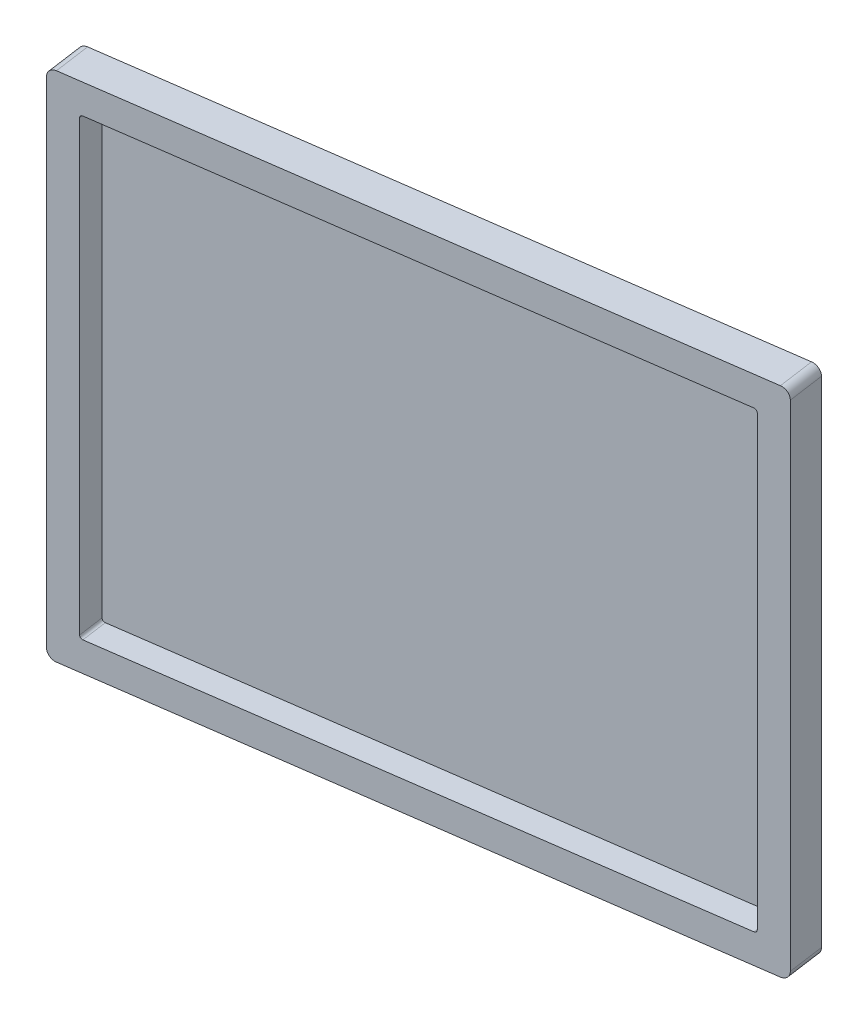
ISO-10303-21;
HEADER;
FILE_DESCRIPTION(('STEP AP214'),'2;1');
FILE_NAME('part.step','',(''),(''),'','','');
FILE_SCHEMA(('AUTOMOTIVE_DESIGN { 1 0 10303 214 1 1 1 1 }'));
ENDSEC;
DATA;
#1=APPLICATION_CONTEXT('core data for automotive mechanical design processes');
#2=APPLICATION_PROTOCOL_DEFINITION('international standard','automotive_design',2000,#1);
#3=PRODUCT_CONTEXT('',#1,'mechanical');
#4=PRODUCT('Part','Part','',(#3));
#5=PRODUCT_RELATED_PRODUCT_CATEGORY('part','',(#4));
#6=PRODUCT_DEFINITION_FORMATION('','',#4);
#7=PRODUCT_DEFINITION_CONTEXT('part definition',#1,'design');
#8=PRODUCT_DEFINITION('design','',#6,#7);
#9=PRODUCT_DEFINITION_SHAPE('','',#8);
#10=(LENGTH_UNIT() NAMED_UNIT(*) SI_UNIT(.MILLI.,.METRE.));
#11=(NAMED_UNIT(*) PLANE_ANGLE_UNIT() SI_UNIT($,.RADIAN.));
#12=(NAMED_UNIT(*) SI_UNIT($,.STERADIAN.) SOLID_ANGLE_UNIT());
#13=UNCERTAINTY_MEASURE_WITH_UNIT(LENGTH_MEASURE(1.E-05),#10,'distance_accuracy_value','');
#14=(GEOMETRIC_REPRESENTATION_CONTEXT(3) GLOBAL_UNCERTAINTY_ASSIGNED_CONTEXT((#13)) GLOBAL_UNIT_ASSIGNED_CONTEXT((#10,
#11,#12)) REPRESENTATION_CONTEXT('',''));
#15=CARTESIAN_POINT('',(0.,0.,0.));
#16=DIRECTION('',(0.,0.,1.));
#17=DIRECTION('',(1.,0.,0.));
#18=AXIS2_PLACEMENT_3D('',#15,#16,#17);
#19=CARTESIAN_POINT('',(387.664057965126,153.,664.601135131367));
#20=DIRECTION('',(0.99026806874157,0.,-0.139173100960065));
#21=DIRECTION('',(-0.139173100960065,0.,-0.99026806874157));
#22=AXIS2_PLACEMENT_3D('',#19,#20,#21);
#23=PLANE('',#22);
#24=DIRECTION('',(-0.139173100960065,0.,-0.99026806874157));
#25=VECTOR('',#24,1.);
#26=CARTESIAN_POINT('',(387.664057965126,153.,664.601135131367));
#27=LINE('',#26,#25);
#28=CARTESIAN_POINT('',(384.741422844965,153.,643.805505687794));
#29=VERTEX_POINT('',#28);
#30=CARTESIAN_POINT('',(384.184730441125,153.,639.844433412828));
#31=VERTEX_POINT('',#30);
#32=EDGE_CURVE('E348',#29,#31,#27,.T.);
#33=ORIENTED_EDGE('',*,*,#32,.F.);
#34=DIRECTION('',(0.,-1.,0.));
#35=VECTOR('',#34,1.);
#36=CARTESIAN_POINT('',(384.741422844965,155.,643.805505687794));
#37=LINE('',#36,#35);
#38=CARTESIAN_POINT('',(384.741422844965,-153.,643.805505687794));
#39=VERTEX_POINT('',#38);
#40=EDGE_CURVE('E461',#29,#39,#37,.T.);
#41=ORIENTED_EDGE('',*,*,#40,.T.);
#42=DIRECTION('',(-0.139173100960065,0.,-0.99026806874157));
#43=VECTOR('',#42,1.);
#44=CARTESIAN_POINT('',(387.664057965126,-153.,664.601135131367));
#45=LINE('',#44,#43);
#46=CARTESIAN_POINT('',(384.184730441125,-153.,639.844433412828));
#47=VERTEX_POINT('',#46);
#48=EDGE_CURVE('E347',#39,#47,#45,.T.);
#49=ORIENTED_EDGE('',*,*,#48,.T.);
#50=DIRECTION('',(0.,-1.,0.));
#51=VECTOR('',#50,1.);
#52=CARTESIAN_POINT('',(384.184730441125,153.,639.844433412828));
#53=LINE('',#52,#51);
#54=EDGE_CURVE('E317',#31,#47,#53,.T.);
#55=ORIENTED_EDGE('',*,*,#54,.F.);
#56=EDGE_LOOP('',(#33,#41,#49,#55));
#57=FACE_BOUND('',#56,.T.);
#58=ADVANCED_FACE('F43',(#57),#23,.T.);
#59=CARTESIAN_POINT('',(793.67396614917,-153.,607.540163737741));
#60=DIRECTION('',(-0.99026806874157,0.,0.139173100960065));
#61=DIRECTION('',(0.139173100960065,0.,0.99026806874157));
#62=AXIS2_PLACEMENT_3D('',#59,#60,#61);
#63=PLANE('',#62);
#64=DIRECTION('',(-0.139173100960065,0.,-0.99026806874157));
#65=VECTOR('',#64,1.);
#66=CARTESIAN_POINT('',(793.67396614917,-153.,607.540163737741));
#67=LINE('',#66,#65);
#68=CARTESIAN_POINT('',(790.751331029009,-153.,586.744534294167));
#69=VERTEX_POINT('',#68);
#70=CARTESIAN_POINT('',(790.194638625169,-153.,582.783462019201));
#71=VERTEX_POINT('',#70);
#72=EDGE_CURVE('E333',#69,#71,#67,.T.);
#73=ORIENTED_EDGE('',*,*,#72,.F.);
#74=DIRECTION('',(0.,1.,0.));
#75=VECTOR('',#74,1.);
#76=CARTESIAN_POINT('',(790.751331029009,-155.,586.744534294167));
#77=LINE('',#76,#75);
#78=CARTESIAN_POINT('',(790.751331029009,153.,586.744534294167));
#79=VERTEX_POINT('',#78);
#80=EDGE_CURVE('E456',#69,#79,#77,.T.);
#81=ORIENTED_EDGE('',*,*,#80,.T.);
#82=DIRECTION('',(-0.139173100960065,0.,-0.99026806874157));
#83=VECTOR('',#82,1.);
#84=CARTESIAN_POINT('',(793.67396614917,153.,607.540163737741));
#85=LINE('',#84,#83);
#86=CARTESIAN_POINT('',(790.194638625169,153.,582.783462019201));
#87=VERTEX_POINT('',#86);
#88=EDGE_CURVE('E309',#79,#87,#85,.T.);
#89=ORIENTED_EDGE('',*,*,#88,.T.);
#90=DIRECTION('',(0.,1.,0.));
#91=VECTOR('',#90,1.);
#92=CARTESIAN_POINT('',(790.194638625169,-153.,582.783462019201));
#93=LINE('',#92,#91);
#94=EDGE_CURVE('E293',#71,#87,#93,.T.);
#95=ORIENTED_EDGE('',*,*,#94,.F.);
#96=EDGE_LOOP('',(#73,#81,#89,#95));
#97=FACE_BOUND('',#96,.T.);
#98=ADVANCED_FACE('F482',(#97),#63,.T.);
#99=CARTESIAN_POINT('',(791.693430011687,153.,607.818509939661));
#100=DIRECTION('',(-0.139173100960065,0.,-0.99026806874157));
#101=DIRECTION('',(-0.99026806874157,0.,0.139173100960065));
#102=AXIS2_PLACEMENT_3D('',#99,#100,#101);
#103=CYLINDRICAL_SURFACE('',#102,1.99999999999999);
#104=ORIENTED_EDGE('',*,*,#88,.F.);
#105=CARTESIAN_POINT('',(788.770794891526,153.,587.022880496088));
#106=DIRECTION('',(0.139173100960065,0.,0.99026806874157));
#107=DIRECTION('',(0.99026806874157,0.,-0.139173100960065));
#108=AXIS2_PLACEMENT_3D('',#105,#106,#107);
#109=CIRCLE('',#108,1.99999999999999);
#110=CARTESIAN_POINT('',(788.770794891526,155.,587.022880496088));
#111=VERTEX_POINT('',#110);
#112=EDGE_CURVE('E287',#79,#111,#109,.T.);
#113=ORIENTED_EDGE('',*,*,#112,.T.);
#114=DIRECTION('',(-0.139173100960065,0.,-0.99026806874157));
#115=VECTOR('',#114,1.);
#116=CARTESIAN_POINT('',(791.693430011687,155.,607.818509939661));
#117=LINE('',#116,#115);
#118=CARTESIAN_POINT('',(788.214102487686,155.,583.061808221121));
#119=VERTEX_POINT('',#118);
#120=EDGE_CURVE('E360',#111,#119,#117,.T.);
#121=ORIENTED_EDGE('',*,*,#120,.T.);
#122=CARTESIAN_POINT('',(788.214102487686,153.,583.061808221121));
#123=DIRECTION('',(0.139173100960065,0.,0.99026806874157));
#124=DIRECTION('',(0.99026806874157,0.,-0.139173100960065));
#125=AXIS2_PLACEMENT_3D('',#122,#123,#124);
#126=CIRCLE('',#125,1.99999999999999);
#127=EDGE_CURVE('E292',#87,#119,#126,.T.);
#128=ORIENTED_EDGE('',*,*,#127,.F.);
#129=EDGE_LOOP('',(#104,#113,#121,#128));
#130=FACE_BOUND('',#129,.T.);
#131=ADVANCED_FACE('F487',(#130),#103,.F.);
#132=CARTESIAN_POINT('',(791.693430011687,155.,607.818509939661));
#133=DIRECTION('',(0.,-1.,0.));
#134=DIRECTION('',(-0.139173100960065,0.,-0.99026806874157));
#135=AXIS2_PLACEMENT_3D('',#132,#133,#134);
#136=PLANE('',#135);
#137=ORIENTED_EDGE('',*,*,#120,.F.);
#138=DIRECTION('',(-0.99026806874157,0.,0.139173100960065));
#139=VECTOR('',#138,1.);
#140=CARTESIAN_POINT('',(790.751331029009,155.,586.744534294167));
#141=LINE('',#140,#139);
#142=CARTESIAN_POINT('',(386.721958982448,155.,643.527159485874));
#143=VERTEX_POINT('',#142);
#144=EDGE_CURVE('E453',#111,#143,#141,.T.);
#145=ORIENTED_EDGE('',*,*,#144,.T.);
#146=DIRECTION('',(-0.139173100960065,0.,-0.99026806874157));
#147=VECTOR('',#146,1.);
#148=CARTESIAN_POINT('',(389.64459410261,155.,664.322788929447));
#149=LINE('',#148,#147);
#150=CARTESIAN_POINT('',(386.165266578608,155.,639.566087210908));
#151=VERTEX_POINT('',#150);
#152=EDGE_CURVE('E354',#143,#151,#149,.T.);
#153=ORIENTED_EDGE('',*,*,#152,.T.);
#154=DIRECTION('',(-0.99026806874157,0.,0.139173100960065));
#155=VECTOR('',#154,1.);
#156=CARTESIAN_POINT('',(788.214102487686,155.,583.061808221121));
#157=LINE('',#156,#155);
#158=EDGE_CURVE('E311',#119,#151,#157,.T.);
#159=ORIENTED_EDGE('',*,*,#158,.F.);
#160=EDGE_LOOP('',(#137,#145,#153,#159));
#161=FACE_BOUND('',#160,.T.);
#162=ADVANCED_FACE('F506',(#161),#136,.T.);
#163=CARTESIAN_POINT('',(389.64459410261,153.,664.322788929447));
#164=DIRECTION('',(-0.139173100960065,0.,-0.99026806874157));
#165=DIRECTION('',(-0.99026806874157,0.,0.139173100960065));
#166=AXIS2_PLACEMENT_3D('',#163,#164,#165);
#167=CYLINDRICAL_SURFACE('',#166,1.99999999999999);
#168=ORIENTED_EDGE('',*,*,#152,.F.);
#169=CARTESIAN_POINT('',(386.721958982448,153.,643.527159485874));
#170=DIRECTION('',(0.139173100960065,0.,0.99026806874157));
#171=DIRECTION('',(0.99026806874157,0.,-0.139173100960065));
#172=AXIS2_PLACEMENT_3D('',#169,#170,#171);
#173=CIRCLE('',#172,1.99999999999999);
#174=EDGE_CURVE('E282',#143,#29,#173,.T.);
#175=ORIENTED_EDGE('',*,*,#174,.T.);
#176=ORIENTED_EDGE('',*,*,#32,.T.);
#177=CARTESIAN_POINT('',(386.165266578608,153.,639.566087210908));
#178=DIRECTION('',(0.139173100960065,0.,0.99026806874157));
#179=DIRECTION('',(0.99026806874157,0.,-0.139173100960065));
#180=AXIS2_PLACEMENT_3D('',#177,#178,#179);
#181=CIRCLE('',#180,1.99999999999999);
#182=EDGE_CURVE('E316',#151,#31,#181,.T.);
#183=ORIENTED_EDGE('',*,*,#182,.F.);
#184=EDGE_LOOP('',(#168,#175,#176,#183));
#185=FACE_BOUND('',#184,.T.);
#186=ADVANCED_FACE('F505',(#185),#167,.F.);
#187=CARTESIAN_POINT('',(389.64459410261,-153.,664.322788929447));
#188=DIRECTION('',(-0.139173100960065,0.,-0.99026806874157));
#189=DIRECTION('',(-0.99026806874157,0.,0.139173100960065));
#190=AXIS2_PLACEMENT_3D('',#187,#188,#189);
#191=CYLINDRICAL_SURFACE('',#190,1.99999999999999);
#192=ORIENTED_EDGE('',*,*,#48,.F.);
#193=CARTESIAN_POINT('',(386.721958982448,-153.,643.527159485874));
#194=DIRECTION('',(0.139173100960065,0.,0.99026806874157));
#195=DIRECTION('',(0.99026806874157,0.,-0.139173100960065));
#196=AXIS2_PLACEMENT_3D('',#193,#194,#195);
#197=CIRCLE('',#196,1.99999999999999);
#198=CARTESIAN_POINT('',(386.721958982448,-155.,643.527159485874));
#199=VERTEX_POINT('',#198);
#200=EDGE_CURVE('E285',#39,#199,#197,.T.);
#201=ORIENTED_EDGE('',*,*,#200,.T.);
#202=DIRECTION('',(-0.139173100960065,0.,-0.99026806874157));
#203=VECTOR('',#202,1.);
#204=CARTESIAN_POINT('',(389.64459410261,-155.,664.322788929447));
#205=LINE('',#204,#203);
#206=CARTESIAN_POINT('',(386.165266578608,-155.,639.566087210908));
#207=VERTEX_POINT('',#206);
#208=EDGE_CURVE('E345',#199,#207,#205,.T.);
#209=ORIENTED_EDGE('',*,*,#208,.T.);
#210=CARTESIAN_POINT('',(386.165266578608,-153.,639.566087210908));
#211=DIRECTION('',(0.139173100960065,0.,0.99026806874157));
#212=DIRECTION('',(0.99026806874157,0.,-0.139173100960065));
#213=AXIS2_PLACEMENT_3D('',#210,#211,#212);
#214=CIRCLE('',#213,1.99999999999999);
#215=EDGE_CURVE('E325',#47,#207,#214,.T.);
#216=ORIENTED_EDGE('',*,*,#215,.F.);
#217=EDGE_LOOP('',(#192,#201,#209,#216));
#218=FACE_BOUND('',#217,.T.);
#219=ADVANCED_FACE('F503',(#218),#191,.F.);
#220=CARTESIAN_POINT('',(389.64459410261,-155.,664.322788929447));
#221=DIRECTION('',(0.,1.,0.));
#222=DIRECTION('',(0.139173100960065,0.,0.99026806874157));
#223=AXIS2_PLACEMENT_3D('',#220,#221,#222);
#224=PLANE('',#223);
#225=ORIENTED_EDGE('',*,*,#208,.F.);
#226=DIRECTION('',(0.99026806874157,0.,-0.139173100960065));
#227=VECTOR('',#226,1.);
#228=CARTESIAN_POINT('',(384.741422844965,-155.,643.805505687794));
#229=LINE('',#228,#227);
#230=CARTESIAN_POINT('',(788.770794891526,-155.,587.022880496088));
#231=VERTEX_POINT('',#230);
#232=EDGE_CURVE('E466',#199,#231,#229,.T.);
#233=ORIENTED_EDGE('',*,*,#232,.T.);
#234=DIRECTION('',(-0.139173100960065,0.,-0.99026806874157));
#235=VECTOR('',#234,1.);
#236=CARTESIAN_POINT('',(791.693430011687,-155.,607.818509939661));
#237=LINE('',#236,#235);
#238=CARTESIAN_POINT('',(788.214102487686,-155.,583.061808221121));
#239=VERTEX_POINT('',#238);
#240=EDGE_CURVE('E336',#231,#239,#237,.T.);
#241=ORIENTED_EDGE('',*,*,#240,.T.);
#242=DIRECTION('',(0.99026806874157,0.,-0.139173100960065));
#243=VECTOR('',#242,1.);
#244=CARTESIAN_POINT('',(386.165266578608,-155.,639.566087210908));
#245=LINE('',#244,#243);
#246=EDGE_CURVE('E324',#207,#239,#245,.T.);
#247=ORIENTED_EDGE('',*,*,#246,.F.);
#248=EDGE_LOOP('',(#225,#233,#241,#247));
#249=FACE_BOUND('',#248,.T.);
#250=ADVANCED_FACE('F515',(#249),#224,.T.);
#251=CARTESIAN_POINT('',(791.693430011687,-153.,607.818509939661));
#252=DIRECTION('',(-0.139173100960065,0.,-0.99026806874157));
#253=DIRECTION('',(-0.99026806874157,0.,0.139173100960065));
#254=AXIS2_PLACEMENT_3D('',#251,#252,#253);
#255=CYLINDRICAL_SURFACE('',#254,1.99999999999999);
#256=ORIENTED_EDGE('',*,*,#240,.F.);
#257=CARTESIAN_POINT('',(788.770794891526,-153.,587.022880496088));
#258=DIRECTION('',(0.139173100960065,0.,0.99026806874157));
#259=DIRECTION('',(0.99026806874157,0.,-0.139173100960065));
#260=AXIS2_PLACEMENT_3D('',#257,#258,#259);
#261=CIRCLE('',#260,1.99999999999999);
#262=EDGE_CURVE('E11',#231,#69,#261,.T.);
#263=ORIENTED_EDGE('',*,*,#262,.T.);
#264=ORIENTED_EDGE('',*,*,#72,.T.);
#265=CARTESIAN_POINT('',(788.214102487686,-153.,583.061808221121));
#266=DIRECTION('',(0.139173100960065,0.,0.99026806874157));
#267=DIRECTION('',(0.99026806874157,0.,-0.139173100960065));
#268=AXIS2_PLACEMENT_3D('',#265,#266,#267);
#269=CIRCLE('',#268,1.99999999999999);
#270=EDGE_CURVE('E327',#239,#71,#269,.T.);
#271=ORIENTED_EDGE('',*,*,#270,.F.);
#272=EDGE_LOOP('',(#256,#263,#264,#271));
#273=FACE_BOUND('',#272,.T.);
#274=ADVANCED_FACE('F528',(#273),#255,.F.);
#275=CARTESIAN_POINT('',(807.537719111552,169.,605.5917403243));
#276=DIRECTION('',(0.139173100960065,0.,0.99026806874157));
#277=DIRECTION('',(0.99026806874157,0.,-0.139173100960065));
#278=AXIS2_PLACEMENT_3D('',#275,#276,#277);
#279=PLANE('',#278);
#280=CARTESIAN_POINT('',(807.537719111552,169.,605.5917403243));
#281=DIRECTION('',(0.139173100960065,0.,0.99026806874157));
#282=DIRECTION('',(0.99026806874157,0.,-0.139173100960065));
#283=AXIS2_PLACEMENT_3D('',#280,#281,#282);
#284=CIRCLE('',#283,6.00000000000003);
#285=CARTESIAN_POINT('',(813.479327524002,169.,604.756701718539));
#286=VERTEX_POINT('',#285);
#287=CARTESIAN_POINT('',(807.537719111552,175.,605.5917403243));
#288=VERTEX_POINT('',#287);
#289=EDGE_CURVE('E363',#286,#288,#284,.T.);
#290=ORIENTED_EDGE('',*,*,#289,.T.);
#291=DIRECTION('',(-0.99026806874157,0.,0.139173100960065));
#292=VECTOR('',#291,1.);
#293=CARTESIAN_POINT('',(807.537719111552,175.,605.5917403243));
#294=LINE('',#293,#292);
#295=CARTESIAN_POINT('',(373.800305002744,175.,666.549558544808));
#296=VERTEX_POINT('',#295);
#297=EDGE_CURVE('E365',#288,#296,#294,.T.);
#298=ORIENTED_EDGE('',*,*,#297,.T.);
#299=CARTESIAN_POINT('',(373.800305002744,169.,666.549558544808));
#300=DIRECTION('',(0.139173100960065,0.,0.99026806874157));
#301=DIRECTION('',(0.99026806874157,0.,-0.139173100960065));
#302=AXIS2_PLACEMENT_3D('',#299,#300,#301);
#303=CIRCLE('',#302,6.00000000000003);
#304=CARTESIAN_POINT('',(367.858696590295,169.,667.384597150569));
#305=VERTEX_POINT('',#304);
#306=EDGE_CURVE('E370',#296,#305,#303,.T.);
#307=ORIENTED_EDGE('',*,*,#306,.T.);
#308=DIRECTION('',(0.,-1.,0.));
#309=VECTOR('',#308,1.);
#310=CARTESIAN_POINT('',(367.858696590295,169.,667.384597150569));
#311=LINE('',#310,#309);
#312=CARTESIAN_POINT('',(367.858696590295,-169.,667.384597150569));
#313=VERTEX_POINT('',#312);
#314=EDGE_CURVE('E369',#305,#313,#311,.T.);
#315=ORIENTED_EDGE('',*,*,#314,.T.);
#316=CARTESIAN_POINT('',(373.800305002744,-169.,666.549558544808));
#317=DIRECTION('',(0.139173100960065,0.,0.99026806874157));
#318=DIRECTION('',(0.99026806874157,0.,-0.139173100960065));
#319=AXIS2_PLACEMENT_3D('',#316,#317,#318);
#320=CIRCLE('',#319,6.00000000000003);
#321=CARTESIAN_POINT('',(373.800305002744,-175.,666.549558544808));
#322=VERTEX_POINT('',#321);
#323=EDGE_CURVE('E371',#313,#322,#320,.T.);
#324=ORIENTED_EDGE('',*,*,#323,.T.);
#325=DIRECTION('',(0.99026806874157,0.,-0.139173100960065));
#326=VECTOR('',#325,1.);
#327=CARTESIAN_POINT('',(373.800305002744,-175.,666.549558544808));
#328=LINE('',#327,#326);
#329=CARTESIAN_POINT('',(807.537719111552,-175.,605.5917403243));
#330=VERTEX_POINT('',#329);
#331=EDGE_CURVE('E373',#322,#330,#328,.T.);
#332=ORIENTED_EDGE('',*,*,#331,.T.);
#333=CARTESIAN_POINT('',(807.537719111552,-169.,605.5917403243));
#334=DIRECTION('',(0.139173100960065,0.,0.99026806874157));
#335=DIRECTION('',(0.99026806874157,0.,-0.139173100960065));
#336=AXIS2_PLACEMENT_3D('',#333,#334,#335);
#337=CIRCLE('',#336,6.00000000000003);
#338=CARTESIAN_POINT('',(813.479327524002,-169.,604.756701718539));
#339=VERTEX_POINT('',#338);
#340=EDGE_CURVE('E374',#330,#339,#337,.T.);
#341=ORIENTED_EDGE('',*,*,#340,.T.);
#342=DIRECTION('',(0.,1.,0.));
#343=VECTOR('',#342,1.);
#344=CARTESIAN_POINT('',(813.479327524002,-169.,604.756701718539));
#345=LINE('',#344,#343);
#346=EDGE_CURVE('E380',#339,#286,#345,.T.);
#347=ORIENTED_EDGE('',*,*,#346,.T.);
#348=EDGE_LOOP('',(#290,#298,#307,#315,#324,#332,#341,#347));
#349=FACE_BOUND('',#348,.T.);
#350=DIRECTION('',(-0.99026806874157,0.,0.139173100960065));
#351=VECTOR('',#350,1.);
#352=CARTESIAN_POINT('',(791.693430011687,155.,607.818509939661));
#353=LINE('',#352,#351);
#354=CARTESIAN_POINT('',(791.693430011687,155.,607.818509939661));
#355=VERTEX_POINT('',#354);
#356=CARTESIAN_POINT('',(389.64459410261,155.,664.322788929447));
#357=VERTEX_POINT('',#356);
#358=EDGE_CURVE('E294',#355,#357,#353,.T.);
#359=ORIENTED_EDGE('',*,*,#358,.F.);
#360=CARTESIAN_POINT('',(791.693430011687,153.,607.818509939661));
#361=DIRECTION('',(0.139173100960065,0.,0.99026806874157));
#362=DIRECTION('',(0.99026806874157,0.,-0.139173100960065));
#363=AXIS2_PLACEMENT_3D('',#360,#361,#362);
#364=CIRCLE('',#363,1.99999999999999);
#365=CARTESIAN_POINT('',(793.67396614917,153.,607.540163737741));
#366=VERTEX_POINT('',#365);
#367=EDGE_CURVE('E295',#366,#355,#364,.T.);
#368=ORIENTED_EDGE('',*,*,#367,.F.);
#369=DIRECTION('',(0.,1.,0.));
#370=VECTOR('',#369,1.);
#371=CARTESIAN_POINT('',(793.67396614917,-153.,607.540163737741));
#372=LINE('',#371,#370);
#373=CARTESIAN_POINT('',(793.67396614917,-153.,607.540163737741));
#374=VERTEX_POINT('',#373);
#375=EDGE_CURVE('E306',#374,#366,#372,.T.);
#376=ORIENTED_EDGE('',*,*,#375,.F.);
#377=CARTESIAN_POINT('',(791.693430011687,-153.,607.818509939661));
#378=DIRECTION('',(0.139173100960065,0.,0.99026806874157));
#379=DIRECTION('',(0.99026806874157,0.,-0.139173100960065));
#380=AXIS2_PLACEMENT_3D('',#377,#378,#379);
#381=CIRCLE('',#380,1.99999999999999);
#382=CARTESIAN_POINT('',(791.693430011687,-155.,607.818509939661));
#383=VERTEX_POINT('',#382);
#384=EDGE_CURVE('E304',#383,#374,#381,.T.);
#385=ORIENTED_EDGE('',*,*,#384,.F.);
#386=DIRECTION('',(0.99026806874157,0.,-0.139173100960065));
#387=VECTOR('',#386,1.);
#388=CARTESIAN_POINT('',(389.64459410261,-155.,664.322788929447));
#389=LINE('',#388,#387);
#390=CARTESIAN_POINT('',(389.64459410261,-155.,664.322788929447));
#391=VERTEX_POINT('',#390);
#392=EDGE_CURVE('E302',#391,#383,#389,.T.);
#393=ORIENTED_EDGE('',*,*,#392,.F.);
#394=CARTESIAN_POINT('',(389.64459410261,-153.,664.322788929447));
#395=DIRECTION('',(0.139173100960065,0.,0.99026806874157));
#396=DIRECTION('',(0.99026806874157,0.,-0.139173100960065));
#397=AXIS2_PLACEMENT_3D('',#394,#395,#396);
#398=CIRCLE('',#397,1.99999999999999);
#399=CARTESIAN_POINT('',(387.664057965126,-153.,664.601135131367));
#400=VERTEX_POINT('',#399);
#401=EDGE_CURVE('E301',#400,#391,#398,.T.);
#402=ORIENTED_EDGE('',*,*,#401,.F.);
#403=DIRECTION('',(0.,-1.,0.));
#404=VECTOR('',#403,1.);
#405=CARTESIAN_POINT('',(387.664057965126,153.,664.601135131367));
#406=LINE('',#405,#404);
#407=CARTESIAN_POINT('',(387.664057965126,153.,664.601135131367));
#408=VERTEX_POINT('',#407);
#409=EDGE_CURVE('E299',#408,#400,#406,.T.);
#410=ORIENTED_EDGE('',*,*,#409,.F.);
#411=CARTESIAN_POINT('',(389.64459410261,153.,664.322788929447));
#412=DIRECTION('',(0.139173100960065,0.,0.99026806874157));
#413=DIRECTION('',(0.99026806874157,0.,-0.139173100960065));
#414=AXIS2_PLACEMENT_3D('',#411,#412,#413);
#415=CIRCLE('',#414,1.99999999999999);
#416=EDGE_CURVE('E300',#357,#408,#415,.T.);
#417=ORIENTED_EDGE('',*,*,#416,.F.);
#418=EDGE_LOOP('',(#359,#368,#376,#385,#393,#402,#410,#417));
#419=FACE_BOUND('',#418,.T.);
#420=ADVANCED_FACE('F436',(#349,#419),#279,.T.);
#421=CARTESIAN_POINT('',(804.058391587551,169.,580.83503860576));
#422=DIRECTION('',(0.139173100960065,0.,0.99026806874157));
#423=DIRECTION('',(0.99026806874157,0.,-0.139173100960065));
#424=AXIS2_PLACEMENT_3D('',#421,#422,#423);
#425=PLANE('',#424);
#426=CARTESIAN_POINT('',(804.058391587551,169.,580.83503860576));
#427=DIRECTION('',(0.139173100960065,0.,0.99026806874157));
#428=DIRECTION('',(0.99026806874157,0.,-0.139173100960065));
#429=AXIS2_PLACEMENT_3D('',#426,#427,#428);
#430=CIRCLE('',#429,6.00000000000003);
#431=CARTESIAN_POINT('',(810.,169.,580.));
#432=VERTEX_POINT('',#431);
#433=CARTESIAN_POINT('',(804.058391587551,175.,580.83503860576));
#434=VERTEX_POINT('',#433);
#435=EDGE_CURVE('E359',#432,#434,#430,.T.);
#436=ORIENTED_EDGE('',*,*,#435,.F.);
#437=DIRECTION('',(0.,1.,0.));
#438=VECTOR('',#437,1.);
#439=CARTESIAN_POINT('',(810.,-169.,580.));
#440=LINE('',#439,#438);
#441=CARTESIAN_POINT('',(810.,-169.,580.));
#442=VERTEX_POINT('',#441);
#443=EDGE_CURVE('E364',#442,#432,#440,.T.);
#444=ORIENTED_EDGE('',*,*,#443,.F.);
#445=CARTESIAN_POINT('',(804.058391587551,-169.,580.83503860576));
#446=DIRECTION('',(0.139173100960065,0.,0.99026806874157));
#447=DIRECTION('',(0.99026806874157,0.,-0.139173100960065));
#448=AXIS2_PLACEMENT_3D('',#445,#446,#447);
#449=CIRCLE('',#448,6.00000000000003);
#450=CARTESIAN_POINT('',(804.058391587551,-175.,580.83503860576));
#451=VERTEX_POINT('',#450);
#452=EDGE_CURVE('E395',#451,#442,#449,.T.);
#453=ORIENTED_EDGE('',*,*,#452,.F.);
#454=DIRECTION('',(0.99026806874157,0.,-0.139173100960065));
#455=VECTOR('',#454,1.);
#456=CARTESIAN_POINT('',(370.320977478743,-175.,641.792856826269));
#457=LINE('',#456,#455);
#458=CARTESIAN_POINT('',(370.320977478743,-175.,641.792856826269));
#459=VERTEX_POINT('',#458);
#460=EDGE_CURVE('E388',#459,#451,#457,.T.);
#461=ORIENTED_EDGE('',*,*,#460,.F.);
#462=CARTESIAN_POINT('',(370.320977478743,-169.,641.792856826269));
#463=DIRECTION('',(0.139173100960065,0.,0.99026806874157));
#464=DIRECTION('',(0.99026806874157,0.,-0.139173100960065));
#465=AXIS2_PLACEMENT_3D('',#462,#463,#464);
#466=CIRCLE('',#465,6.00000000000003);
#467=CARTESIAN_POINT('',(364.379369066293,-169.,642.627895432029));
#468=VERTEX_POINT('',#467);
#469=EDGE_CURVE('E389',#468,#459,#466,.T.);
#470=ORIENTED_EDGE('',*,*,#469,.F.);
#471=DIRECTION('',(0.,-1.,0.));
#472=VECTOR('',#471,1.);
#473=CARTESIAN_POINT('',(364.379369066293,169.,642.627895432029));
#474=LINE('',#473,#472);
#475=CARTESIAN_POINT('',(364.379369066293,169.,642.627895432029));
#476=VERTEX_POINT('',#475);
#477=EDGE_CURVE('E387',#476,#468,#474,.T.);
#478=ORIENTED_EDGE('',*,*,#477,.F.);
#479=CARTESIAN_POINT('',(370.320977478743,169.,641.792856826269));
#480=DIRECTION('',(0.139173100960065,0.,0.99026806874157));
#481=DIRECTION('',(0.99026806874157,0.,-0.139173100960065));
#482=AXIS2_PLACEMENT_3D('',#479,#480,#481);
#483=CIRCLE('',#482,6.00000000000003);
#484=CARTESIAN_POINT('',(370.320977478743,175.,641.792856826269));
#485=VERTEX_POINT('',#484);
#486=EDGE_CURVE('E383',#485,#476,#483,.T.);
#487=ORIENTED_EDGE('',*,*,#486,.F.);
#488=DIRECTION('',(-0.99026806874157,0.,0.139173100960065));
#489=VECTOR('',#488,1.);
#490=CARTESIAN_POINT('',(804.058391587551,175.,580.83503860576));
#491=LINE('',#490,#489);
#492=EDGE_CURVE('E385',#434,#485,#491,.T.);
#493=ORIENTED_EDGE('',*,*,#492,.F.);
#494=EDGE_LOOP('',(#436,#444,#453,#461,#470,#478,#487,#493));
#495=FACE_BOUND('',#494,.T.);
#496=ORIENTED_EDGE('',*,*,#127,.T.);
#497=ORIENTED_EDGE('',*,*,#158,.T.);
#498=ORIENTED_EDGE('',*,*,#182,.T.);
#499=ORIENTED_EDGE('',*,*,#54,.T.);
#500=ORIENTED_EDGE('',*,*,#215,.T.);
#501=ORIENTED_EDGE('',*,*,#246,.T.);
#502=ORIENTED_EDGE('',*,*,#270,.T.);
#503=ORIENTED_EDGE('',*,*,#94,.T.);
#504=EDGE_LOOP('',(#496,#497,#498,#499,#500,#501,#502,#503));
#505=FACE_BOUND('',#504,.T.);
#506=ADVANCED_FACE('F532',(#495,#505),#425,.F.);
#507=CARTESIAN_POINT('',(807.537719111552,169.,605.5917403243));
#508=DIRECTION('',(-0.139173100960065,0.,-0.99026806874157));
#509=DIRECTION('',(-0.99026806874157,0.,0.139173100960065));
#510=AXIS2_PLACEMENT_3D('',#507,#508,#509);
#511=CYLINDRICAL_SURFACE('',#510,6.00000000000003);
#512=ORIENTED_EDGE('',*,*,#435,.T.);
#513=DIRECTION('',(-0.139173100960065,0.,-0.99026806874157));
#514=VECTOR('',#513,1.);
#515=CARTESIAN_POINT('',(807.537719111552,175.,605.5917403243));
#516=LINE('',#515,#514);
#517=EDGE_CURVE('E414',#288,#434,#516,.T.);
#518=ORIENTED_EDGE('',*,*,#517,.F.);
#519=ORIENTED_EDGE('',*,*,#289,.F.);
#520=DIRECTION('',(-0.139173100960065,0.,-0.99026806874157));
#521=VECTOR('',#520,1.);
#522=CARTESIAN_POINT('',(813.479327524002,169.,604.756701718539));
#523=LINE('',#522,#521);
#524=EDGE_CURVE('E377',#286,#432,#523,.T.);
#525=ORIENTED_EDGE('',*,*,#524,.T.);
#526=EDGE_LOOP('',(#512,#518,#519,#525));
#527=FACE_BOUND('',#526,.T.);
#528=ADVANCED_FACE('F44',(#527),#511,.T.);
#529=CARTESIAN_POINT('',(807.537719111552,175.,605.5917403243));
#530=DIRECTION('',(0.,-1.,0.));
#531=DIRECTION('',(-0.139173100960065,0.,-0.99026806874157));
#532=AXIS2_PLACEMENT_3D('',#529,#530,#531);
#533=PLANE('',#532);
#534=ORIENTED_EDGE('',*,*,#492,.T.);
#535=DIRECTION('',(-0.139173100960065,0.,-0.99026806874157));
#536=VECTOR('',#535,1.);
#537=CARTESIAN_POINT('',(373.800305002744,175.,666.549558544808));
#538=LINE('',#537,#536);
#539=EDGE_CURVE('E415',#296,#485,#538,.T.);
#540=ORIENTED_EDGE('',*,*,#539,.F.);
#541=ORIENTED_EDGE('',*,*,#297,.F.);
#542=ORIENTED_EDGE('',*,*,#517,.T.);
#543=EDGE_LOOP('',(#534,#540,#541,#542));
#544=FACE_BOUND('',#543,.T.);
#545=ADVANCED_FACE('F542',(#544),#533,.F.);
#546=CARTESIAN_POINT('',(373.800305002744,169.,666.549558544808));
#547=DIRECTION('',(-0.139173100960065,0.,-0.99026806874157));
#548=DIRECTION('',(-0.99026806874157,0.,0.139173100960065));
#549=AXIS2_PLACEMENT_3D('',#546,#547,#548);
#550=CYLINDRICAL_SURFACE('',#549,6.00000000000003);
#551=ORIENTED_EDGE('',*,*,#486,.T.);
#552=DIRECTION('',(-0.139173100960065,0.,-0.99026806874157));
#553=VECTOR('',#552,1.);
#554=CARTESIAN_POINT('',(367.858696590295,169.,667.384597150569));
#555=LINE('',#554,#553);
#556=EDGE_CURVE('E409',#305,#476,#555,.T.);
#557=ORIENTED_EDGE('',*,*,#556,.F.);
#558=ORIENTED_EDGE('',*,*,#306,.F.);
#559=ORIENTED_EDGE('',*,*,#539,.T.);
#560=EDGE_LOOP('',(#551,#557,#558,#559));
#561=FACE_BOUND('',#560,.T.);
#562=ADVANCED_FACE('F569',(#561),#550,.T.);
#563=CARTESIAN_POINT('',(367.858696590295,169.,667.384597150569));
#564=DIRECTION('',(0.99026806874157,0.,-0.139173100960065));
#565=DIRECTION('',(-0.139173100960065,0.,-0.99026806874157));
#566=AXIS2_PLACEMENT_3D('',#563,#564,#565);
#567=PLANE('',#566);
#568=ORIENTED_EDGE('',*,*,#477,.T.);
#569=DIRECTION('',(-0.139173100960065,0.,-0.99026806874157));
#570=VECTOR('',#569,1.);
#571=CARTESIAN_POINT('',(367.858696590295,-169.,667.384597150569));
#572=LINE('',#571,#570);
#573=EDGE_CURVE('E408',#313,#468,#572,.T.);
#574=ORIENTED_EDGE('',*,*,#573,.F.);
#575=ORIENTED_EDGE('',*,*,#314,.F.);
#576=ORIENTED_EDGE('',*,*,#556,.T.);
#577=EDGE_LOOP('',(#568,#574,#575,#576));
#578=FACE_BOUND('',#577,.T.);
#579=ADVANCED_FACE('F564',(#578),#567,.F.);
#580=CARTESIAN_POINT('',(373.800305002744,-169.,666.549558544808));
#581=DIRECTION('',(-0.139173100960065,0.,-0.99026806874157));
#582=DIRECTION('',(-0.99026806874157,0.,0.139173100960065));
#583=AXIS2_PLACEMENT_3D('',#580,#581,#582);
#584=CYLINDRICAL_SURFACE('',#583,6.00000000000003);
#585=ORIENTED_EDGE('',*,*,#469,.T.);
#586=DIRECTION('',(-0.139173100960065,0.,-0.99026806874157));
#587=VECTOR('',#586,1.);
#588=CARTESIAN_POINT('',(373.800305002744,-175.,666.549558544808));
#589=LINE('',#588,#587);
#590=EDGE_CURVE('E401',#322,#459,#589,.T.);
#591=ORIENTED_EDGE('',*,*,#590,.F.);
#592=ORIENTED_EDGE('',*,*,#323,.F.);
#593=ORIENTED_EDGE('',*,*,#573,.T.);
#594=EDGE_LOOP('',(#585,#591,#592,#593));
#595=FACE_BOUND('',#594,.T.);
#596=ADVANCED_FACE('F561',(#595),#584,.T.);
#597=CARTESIAN_POINT('',(373.800305002744,-175.,666.549558544808));
#598=DIRECTION('',(0.,1.,0.));
#599=DIRECTION('',(0.139173100960065,0.,0.99026806874157));
#600=AXIS2_PLACEMENT_3D('',#597,#598,#599);
#601=PLANE('',#600);
#602=ORIENTED_EDGE('',*,*,#460,.T.);
#603=DIRECTION('',(-0.139173100960065,0.,-0.99026806874157));
#604=VECTOR('',#603,1.);
#605=CARTESIAN_POINT('',(807.537719111552,-175.,605.5917403243));
#606=LINE('',#605,#604);
#607=EDGE_CURVE('E399',#330,#451,#606,.T.);
#608=ORIENTED_EDGE('',*,*,#607,.F.);
#609=ORIENTED_EDGE('',*,*,#331,.F.);
#610=ORIENTED_EDGE('',*,*,#590,.T.);
#611=EDGE_LOOP('',(#602,#608,#609,#610));
#612=FACE_BOUND('',#611,.T.);
#613=ADVANCED_FACE('F560',(#612),#601,.F.);
#614=CARTESIAN_POINT('',(807.537719111552,-169.,605.5917403243));
#615=DIRECTION('',(-0.139173100960065,0.,-0.99026806874157));
#616=DIRECTION('',(-0.99026806874157,0.,0.139173100960065));
#617=AXIS2_PLACEMENT_3D('',#614,#615,#616);
#618=CYLINDRICAL_SURFACE('',#617,6.00000000000003);
#619=ORIENTED_EDGE('',*,*,#452,.T.);
#620=DIRECTION('',(-0.139173100960065,0.,-0.99026806874157));
#621=VECTOR('',#620,1.);
#622=CARTESIAN_POINT('',(813.479327524002,-169.,604.756701718539));
#623=LINE('',#622,#621);
#624=EDGE_CURVE('E400',#339,#442,#623,.T.);
#625=ORIENTED_EDGE('',*,*,#624,.F.);
#626=ORIENTED_EDGE('',*,*,#340,.F.);
#627=ORIENTED_EDGE('',*,*,#607,.T.);
#628=EDGE_LOOP('',(#619,#625,#626,#627));
#629=FACE_BOUND('',#628,.T.);
#630=ADVANCED_FACE('F554',(#629),#618,.T.);
#631=CARTESIAN_POINT('',(813.479327524002,-169.,604.756701718539));
#632=DIRECTION('',(-0.99026806874157,0.,0.139173100960065));
#633=DIRECTION('',(0.139173100960065,0.,0.99026806874157));
#634=AXIS2_PLACEMENT_3D('',#631,#632,#633);
#635=PLANE('',#634);
#636=ORIENTED_EDGE('',*,*,#443,.T.);
#637=ORIENTED_EDGE('',*,*,#524,.F.);
#638=ORIENTED_EDGE('',*,*,#346,.F.);
#639=ORIENTED_EDGE('',*,*,#624,.T.);
#640=EDGE_LOOP('',(#636,#637,#638,#639));
#641=FACE_BOUND('',#640,.T.);
#642=ADVANCED_FACE('F552',(#641),#635,.F.);
#643=CARTESIAN_POINT('',(789.188314194406,153.,589.993684702312));
#644=DIRECTION('',(0.139173100960065,0.,0.99026806874157));
#645=DIRECTION('',(0.99026806874157,0.,-0.139173100960065));
#646=AXIS2_PLACEMENT_3D('',#643,#644,#645);
#647=CIRCLE('',#646,1.99999999999999);
#648=CARTESIAN_POINT('',(791.168850331889,153.,589.715338500392));
#649=VERTEX_POINT('',#648);
#650=CARTESIAN_POINT('',(789.188314194406,155.,589.993684702312));
#651=VERTEX_POINT('',#650);
#652=EDGE_CURVE('E59',#649,#651,#647,.T.);
#653=ORIENTED_EDGE('',*,*,#652,.F.);
#654=EDGE_CURVE('E334',#366,#649,#85,.T.);
#655=ORIENTED_EDGE('',*,*,#654,.F.);
#656=ORIENTED_EDGE('',*,*,#367,.T.);
#657=EDGE_CURVE('E357',#355,#651,#117,.T.);
#658=ORIENTED_EDGE('',*,*,#657,.T.);
#659=EDGE_LOOP('',(#653,#655,#656,#658));
#660=FACE_BOUND('',#659,.T.);
#661=ADVANCED_FACE('F445',(#660),#103,.F.);
#662=DIRECTION('',(-0.99026806874157,0.,0.139173100960065));
#663=VECTOR('',#662,1.);
#664=CARTESIAN_POINT('',(791.168850331889,155.,589.715338500392));
#665=LINE('',#664,#663);
#666=CARTESIAN_POINT('',(387.139478285328,155.,646.497963692099));
#667=VERTEX_POINT('',#666);
#668=EDGE_CURVE('E66',#651,#667,#665,.T.);
#669=ORIENTED_EDGE('',*,*,#668,.F.);
#670=ORIENTED_EDGE('',*,*,#657,.F.);
#671=ORIENTED_EDGE('',*,*,#358,.T.);
#672=EDGE_CURVE('E352',#357,#667,#149,.T.);
#673=ORIENTED_EDGE('',*,*,#672,.T.);
#674=EDGE_LOOP('',(#669,#670,#671,#673));
#675=FACE_BOUND('',#674,.T.);
#676=ADVANCED_FACE('F444',(#675),#136,.T.);
#677=CARTESIAN_POINT('',(387.139478285328,153.,646.497963692099));
#678=DIRECTION('',(0.139173100960065,0.,0.99026806874157));
#679=DIRECTION('',(0.99026806874157,0.,-0.139173100960065));
#680=AXIS2_PLACEMENT_3D('',#677,#678,#679);
#681=CIRCLE('',#680,1.99999999999999);
#682=CARTESIAN_POINT('',(385.158942147845,153.,646.776309894019));
#683=VERTEX_POINT('',#682);
#684=EDGE_CURVE('E279',#667,#683,#681,.T.);
#685=ORIENTED_EDGE('',*,*,#684,.F.);
#686=ORIENTED_EDGE('',*,*,#672,.F.);
#687=ORIENTED_EDGE('',*,*,#416,.T.);
#688=EDGE_CURVE('E353',#408,#683,#27,.T.);
#689=ORIENTED_EDGE('',*,*,#688,.T.);
#690=EDGE_LOOP('',(#685,#686,#687,#689));
#691=FACE_BOUND('',#690,.T.);
#692=ADVANCED_FACE('F446',(#691),#167,.F.);
#693=DIRECTION('',(0.,-1.,0.));
#694=VECTOR('',#693,1.);
#695=CARTESIAN_POINT('',(385.158942147845,155.,646.776309894019));
#696=LINE('',#695,#694);
#697=CARTESIAN_POINT('',(385.158942147845,-153.,646.776309894019));
#698=VERTEX_POINT('',#697);
#699=EDGE_CURVE('E452',#683,#698,#696,.T.);
#700=ORIENTED_EDGE('',*,*,#699,.F.);
#701=ORIENTED_EDGE('',*,*,#688,.F.);
#702=ORIENTED_EDGE('',*,*,#409,.T.);
#703=EDGE_CURVE('E350',#400,#698,#45,.T.);
#704=ORIENTED_EDGE('',*,*,#703,.T.);
#705=EDGE_LOOP('',(#700,#701,#702,#704));
#706=FACE_BOUND('',#705,.T.);
#707=ADVANCED_FACE('F447',(#706),#23,.T.);
#708=CARTESIAN_POINT('',(387.139478285328,-153.,646.497963692099));
#709=DIRECTION('',(0.139173100960065,0.,0.99026806874157));
#710=DIRECTION('',(0.99026806874157,0.,-0.139173100960065));
#711=AXIS2_PLACEMENT_3D('',#708,#709,#710);
#712=CIRCLE('',#711,1.99999999999999);
#713=CARTESIAN_POINT('',(387.139478285328,-155.,646.497963692099));
#714=VERTEX_POINT('',#713);
#715=EDGE_CURVE('E274',#698,#714,#712,.T.);
#716=ORIENTED_EDGE('',*,*,#715,.F.);
#717=ORIENTED_EDGE('',*,*,#703,.F.);
#718=ORIENTED_EDGE('',*,*,#401,.T.);
#719=EDGE_CURVE('E342',#391,#714,#205,.T.);
#720=ORIENTED_EDGE('',*,*,#719,.T.);
#721=EDGE_LOOP('',(#716,#717,#718,#720));
#722=FACE_BOUND('',#721,.T.);
#723=ADVANCED_FACE('F497',(#722),#191,.F.);
#724=DIRECTION('',(0.99026806874157,0.,-0.139173100960065));
#725=VECTOR('',#724,1.);
#726=CARTESIAN_POINT('',(385.158942147845,-155.,646.776309894019));
#727=LINE('',#726,#725);
#728=CARTESIAN_POINT('',(789.188314194406,-155.,589.993684702312));
#729=VERTEX_POINT('',#728);
#730=EDGE_CURVE('E424',#714,#729,#727,.T.);
#731=ORIENTED_EDGE('',*,*,#730,.F.);
#732=ORIENTED_EDGE('',*,*,#719,.F.);
#733=ORIENTED_EDGE('',*,*,#392,.T.);
#734=EDGE_CURVE('E339',#383,#729,#237,.T.);
#735=ORIENTED_EDGE('',*,*,#734,.T.);
#736=EDGE_LOOP('',(#731,#732,#733,#735));
#737=FACE_BOUND('',#736,.T.);
#738=ADVANCED_FACE('F429',(#737),#224,.T.);
#739=CARTESIAN_POINT('',(789.188314194406,-153.,589.993684702312));
#740=DIRECTION('',(0.139173100960065,0.,0.99026806874157));
#741=DIRECTION('',(0.99026806874157,0.,-0.139173100960065));
#742=AXIS2_PLACEMENT_3D('',#739,#740,#741);
#743=CIRCLE('',#742,1.99999999999999);
#744=CARTESIAN_POINT('',(791.168850331889,-153.,589.715338500392));
#745=VERTEX_POINT('',#744);
#746=EDGE_CURVE('E51',#729,#745,#743,.T.);
#747=ORIENTED_EDGE('',*,*,#746,.F.);
#748=ORIENTED_EDGE('',*,*,#734,.F.);
#749=ORIENTED_EDGE('',*,*,#384,.T.);
#750=EDGE_CURVE('E338',#374,#745,#67,.T.);
#751=ORIENTED_EDGE('',*,*,#750,.T.);
#752=EDGE_LOOP('',(#747,#748,#749,#751));
#753=FACE_BOUND('',#752,.T.);
#754=ADVANCED_FACE('F430',(#753),#255,.F.);
#755=DIRECTION('',(0.,1.,0.));
#756=VECTOR('',#755,1.);
#757=CARTESIAN_POINT('',(791.168850331889,-155.,589.715338500392));
#758=LINE('',#757,#756);
#759=EDGE_CURVE('E421',#745,#649,#758,.T.);
#760=ORIENTED_EDGE('',*,*,#759,.F.);
#761=ORIENTED_EDGE('',*,*,#750,.F.);
#762=ORIENTED_EDGE('',*,*,#375,.T.);
#763=ORIENTED_EDGE('',*,*,#654,.T.);
#764=EDGE_LOOP('',(#760,#761,#762,#763));
#765=FACE_BOUND('',#764,.T.);
#766=ADVANCED_FACE('F442',(#765),#63,.T.);
#767=CARTESIAN_POINT('',(588.163896239867,0.,618.245824197206));
#768=DIRECTION('',(0.139173100960065,0.,0.99026806874157));
#769=DIRECTION('',(0.99026806874157,0.,-0.139173100960065));
#770=AXIS2_PLACEMENT_3D('',#767,#768,#769);
#771=PLANE('',#770);
#772=ORIENTED_EDGE('',*,*,#759,.T.);
#773=ORIENTED_EDGE('',*,*,#652,.T.);
#774=ORIENTED_EDGE('',*,*,#668,.T.);
#775=ORIENTED_EDGE('',*,*,#684,.T.);
#776=ORIENTED_EDGE('',*,*,#699,.T.);
#777=ORIENTED_EDGE('',*,*,#715,.T.);
#778=ORIENTED_EDGE('',*,*,#730,.T.);
#779=ORIENTED_EDGE('',*,*,#746,.T.);
#780=EDGE_LOOP('',(#772,#773,#774,#775,#776,#777,#778,#779));
#781=FACE_BOUND('',#780,.T.);
#782=ADVANCED_FACE('F423',(#781),#771,.T.);
#783=CARTESIAN_POINT('',(587.746376936987,0.,615.275019990981));
#784=DIRECTION('',(0.139173100960065,0.,0.99026806874157));
#785=DIRECTION('',(0.99026806874157,0.,-0.139173100960065));
#786=AXIS2_PLACEMENT_3D('',#783,#784,#785);
#787=PLANE('',#786);
#788=DIRECTION('',(-0.99026806874157,0.,0.139173100960065));
#789=VECTOR('',#788,1.);
#790=CARTESIAN_POINT('',(726.383906560807,40.,595.790785856572));
#791=LINE('',#790,#789);
#792=CARTESIAN_POINT('',(726.383906560807,40.,595.790785856572));
#793=VERTEX_POINT('',#792);
#794=CARTESIAN_POINT('',(647.162461061482,40.,606.924633933377));
#795=VERTEX_POINT('',#794);
#796=EDGE_CURVE('E249',#793,#795,#791,.T.);
#797=ORIENTED_EDGE('',*,*,#796,.T.);
#798=DIRECTION('',(0.,-1.,0.));
#799=VECTOR('',#798,1.);
#800=CARTESIAN_POINT('',(647.162461061481,40.,606.924633933377));
#801=LINE('',#800,#799);
#802=CARTESIAN_POINT('',(647.162461061481,-40.,606.924633933377));
#803=VERTEX_POINT('',#802);
#804=EDGE_CURVE('E235',#795,#803,#801,.T.);
#805=ORIENTED_EDGE('',*,*,#804,.T.);
#806=DIRECTION('',(0.99026806874157,0.,-0.139173100960065));
#807=VECTOR('',#806,1.);
#808=CARTESIAN_POINT('',(647.162461061481,-40.,606.924633933377));
#809=LINE('',#808,#807);
#810=CARTESIAN_POINT('',(726.383906560807,-40.,595.790785856572));
#811=VERTEX_POINT('',#810);
#812=EDGE_CURVE('E241',#803,#811,#809,.T.);
#813=ORIENTED_EDGE('',*,*,#812,.T.);
#814=DIRECTION('',(0.,1.,0.));
#815=VECTOR('',#814,1.);
#816=CARTESIAN_POINT('',(726.383906560807,-40.,595.790785856572));
#817=LINE('',#816,#815);
#818=EDGE_CURVE('E256',#811,#793,#817,.T.);
#819=ORIENTED_EDGE('',*,*,#818,.T.);
#820=EDGE_LOOP('',(#797,#805,#813,#819));
#821=FACE_BOUND('',#820,.T.);
#822=ORIENTED_EDGE('',*,*,#112,.F.);
#823=ORIENTED_EDGE('',*,*,#80,.F.);
#824=ORIENTED_EDGE('',*,*,#262,.F.);
#825=ORIENTED_EDGE('',*,*,#232,.F.);
#826=ORIENTED_EDGE('',*,*,#200,.F.);
#827=ORIENTED_EDGE('',*,*,#40,.F.);
#828=ORIENTED_EDGE('',*,*,#174,.F.);
#829=ORIENTED_EDGE('',*,*,#144,.F.);
#830=EDGE_LOOP('',(#822,#823,#824,#825,#826,#827,#828,#829));
#831=FACE_BOUND('',#830,.T.);
#832=ADVANCED_FACE('F254',(#821,#831),#787,.F.);
#833=CARTESIAN_POINT('',(647.162461061481,40.,606.924633933377));
#834=DIRECTION('',(0.99026806874157,0.,-0.139173100960065));
#835=DIRECTION('',(-0.139173100960065,0.,-0.99026806874157));
#836=AXIS2_PLACEMENT_3D('',#833,#834,#835);
#837=PLANE('',#836);
#838=DIRECTION('',(0.,-1.,0.));
#839=VECTOR('',#838,1.);
#840=CARTESIAN_POINT('',(644.10065284036,40.,585.138736421063));
#841=LINE('',#840,#839);
#842=CARTESIAN_POINT('',(644.10065284036,40.,585.138736421063));
#843=VERTEX_POINT('',#842);
#844=CARTESIAN_POINT('',(644.10065284036,-40.,585.138736421063));
#845=VERTEX_POINT('',#844);
#846=EDGE_CURVE('E263',#843,#845,#841,.T.);
#847=ORIENTED_EDGE('',*,*,#846,.T.);
#848=DIRECTION('',(-0.139173100960065,0.,-0.99026806874157));
#849=VECTOR('',#848,1.);
#850=CARTESIAN_POINT('',(647.162461061481,-40.,606.924633933377));
#851=LINE('',#850,#849);
#852=EDGE_CURVE('E239',#803,#845,#851,.T.);
#853=ORIENTED_EDGE('',*,*,#852,.F.);
#854=ORIENTED_EDGE('',*,*,#804,.F.);
#855=DIRECTION('',(-0.139173100960065,0.,-0.99026806874157));
#856=VECTOR('',#855,1.);
#857=CARTESIAN_POINT('',(647.162461061481,40.,606.924633933377));
#858=LINE('',#857,#856);
#859=EDGE_CURVE('E237',#795,#843,#858,.T.);
#860=ORIENTED_EDGE('',*,*,#859,.T.);
#861=EDGE_LOOP('',(#847,#853,#854,#860));
#862=FACE_BOUND('',#861,.T.);
#863=ADVANCED_FACE('F234',(#862),#837,.F.);
#864=CARTESIAN_POINT('',(647.162461061481,-40.,606.924633933377));
#865=DIRECTION('',(0.,1.,0.));
#866=DIRECTION('',(0.139173100960065,0.,0.99026806874157));
#867=AXIS2_PLACEMENT_3D('',#864,#865,#866);
#868=PLANE('',#867);
#869=DIRECTION('',(0.99026806874157,0.,-0.139173100960065));
#870=VECTOR('',#869,1.);
#871=CARTESIAN_POINT('',(644.10065284036,-40.,585.138736421063));
#872=LINE('',#871,#870);
#873=CARTESIAN_POINT('',(723.322098339685,-40.,574.004888344257));
#874=VERTEX_POINT('',#873);
#875=EDGE_CURVE('E264',#845,#874,#872,.T.);
#876=ORIENTED_EDGE('',*,*,#875,.T.);
#877=DIRECTION('',(-0.139173100960065,0.,-0.99026806874157));
#878=VECTOR('',#877,1.);
#879=CARTESIAN_POINT('',(726.383906560807,-40.,595.790785856572));
#880=LINE('',#879,#878);
#881=EDGE_CURVE('E271',#811,#874,#880,.T.);
#882=ORIENTED_EDGE('',*,*,#881,.F.);
#883=ORIENTED_EDGE('',*,*,#812,.F.);
#884=ORIENTED_EDGE('',*,*,#852,.T.);
#885=EDGE_LOOP('',(#876,#882,#883,#884));
#886=FACE_BOUND('',#885,.T.);
#887=ADVANCED_FACE('F473',(#886),#868,.F.);
#888=CARTESIAN_POINT('',(726.383906560807,-40.,595.790785856572));
#889=DIRECTION('',(-0.99026806874157,0.,0.139173100960065));
#890=DIRECTION('',(0.139173100960065,0.,0.99026806874157));
#891=AXIS2_PLACEMENT_3D('',#888,#889,#890);
#892=PLANE('',#891);
#893=DIRECTION('',(0.,1.,0.));
#894=VECTOR('',#893,1.);
#895=CARTESIAN_POINT('',(723.322098339685,-40.,574.004888344257));
#896=LINE('',#895,#894);
#897=CARTESIAN_POINT('',(723.322098339685,40.,574.004888344257));
#898=VERTEX_POINT('',#897);
#899=EDGE_CURVE('E270',#874,#898,#896,.T.);
#900=ORIENTED_EDGE('',*,*,#899,.T.);
#901=DIRECTION('',(-0.139173100960065,0.,-0.99026806874157));
#902=VECTOR('',#901,1.);
#903=CARTESIAN_POINT('',(726.383906560807,40.,595.790785856572));
#904=LINE('',#903,#902);
#905=EDGE_CURVE('E251',#793,#898,#904,.T.);
#906=ORIENTED_EDGE('',*,*,#905,.F.);
#907=ORIENTED_EDGE('',*,*,#818,.F.);
#908=ORIENTED_EDGE('',*,*,#881,.T.);
#909=EDGE_LOOP('',(#900,#906,#907,#908));
#910=FACE_BOUND('',#909,.T.);
#911=ADVANCED_FACE('F475',(#910),#892,.F.);
#912=CARTESIAN_POINT('',(726.383906560807,40.,595.790785856572));
#913=DIRECTION('',(0.,-1.,0.));
#914=DIRECTION('',(-0.139173100960065,0.,-0.99026806874157));
#915=AXIS2_PLACEMENT_3D('',#912,#913,#914);
#916=PLANE('',#915);
#917=DIRECTION('',(-0.99026806874157,0.,0.139173100960065));
#918=VECTOR('',#917,1.);
#919=CARTESIAN_POINT('',(723.322098339685,40.,574.004888344257));
#920=LINE('',#919,#918);
#921=EDGE_CURVE('E244',#898,#843,#920,.T.);
#922=ORIENTED_EDGE('',*,*,#921,.T.);
#923=ORIENTED_EDGE('',*,*,#859,.F.);
#924=ORIENTED_EDGE('',*,*,#796,.F.);
#925=ORIENTED_EDGE('',*,*,#905,.T.);
#926=EDGE_LOOP('',(#922,#923,#924,#925));
#927=FACE_BOUND('',#926,.T.);
#928=ADVANCED_FACE('F247',(#927),#916,.F.);
#929=CARTESIAN_POINT('',(584.684568715865,0.,593.489122478666));
#930=DIRECTION('',(0.139173100960065,0.,0.99026806874157));
#931=DIRECTION('',(0.99026806874157,0.,-0.139173100960065));
#932=AXIS2_PLACEMENT_3D('',#929,#930,#931);
#933=PLANE('',#932);
#934=ORIENTED_EDGE('',*,*,#846,.F.);
#935=ORIENTED_EDGE('',*,*,#921,.F.);
#936=ORIENTED_EDGE('',*,*,#899,.F.);
#937=ORIENTED_EDGE('',*,*,#875,.F.);
#938=EDGE_LOOP('',(#934,#935,#936,#937));
#939=FACE_BOUND('',#938,.T.);
#940=ADVANCED_FACE('F478',(#939),#933,.F.);
#941=CLOSED_SHELL('',(#58,#98,#131,#162,#186,#219,#250,#274,#420,#506,#528,#545,#562,#579,#596,
#613,#630,#642,#661,#676,#692,#707,#723,#738,#754,#766,#782,#832,#863,#887,#911,#928,#940));
#942=MANIFOLD_SOLID_BREP('B2',#941);
#943=ADVANCED_BREP_SHAPE_REPRESENTATION('',(#18,#942),#14);
#944=SHAPE_DEFINITION_REPRESENTATION(#9,#943);
ENDSEC;
END-ISO-10303-21;
